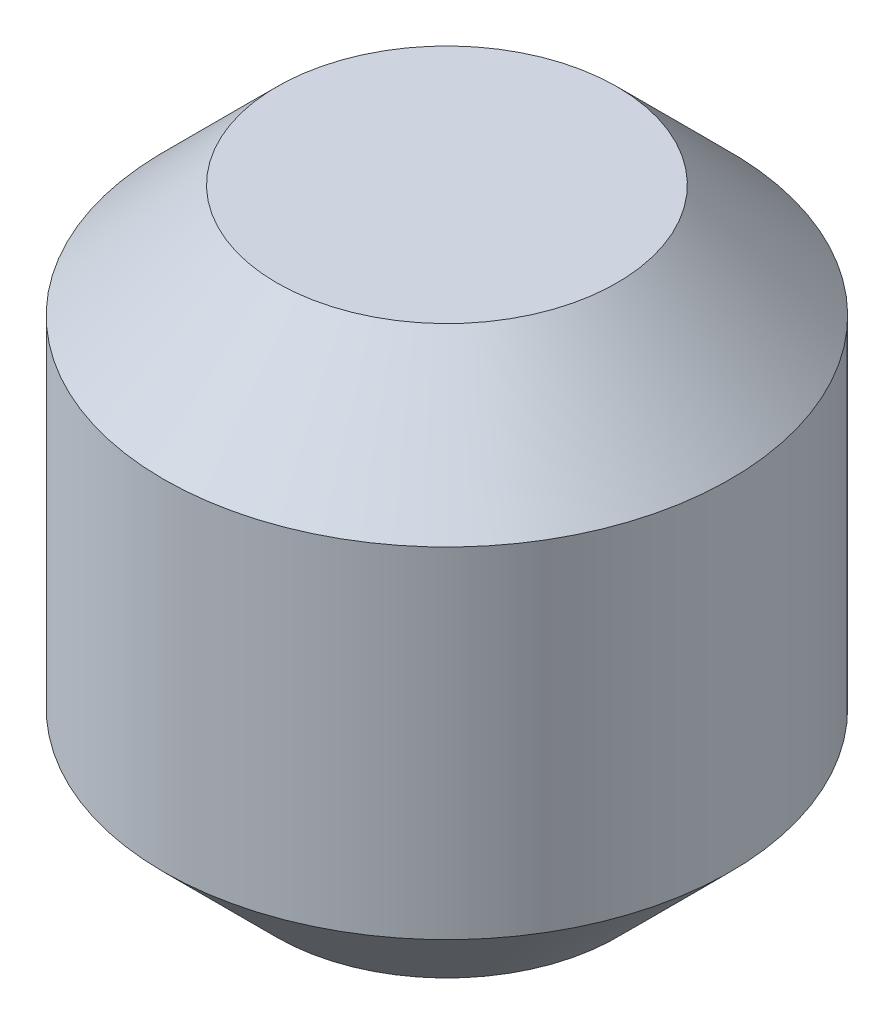
ISO-10303-21;
HEADER;
FILE_DESCRIPTION(('STEP AP214'),'2;1');
FILE_NAME('part.step','',(''),(''),'','','');
FILE_SCHEMA(('AUTOMOTIVE_DESIGN { 1 0 10303 214 1 1 1 1 }'));
ENDSEC;
DATA;
#1=APPLICATION_CONTEXT('core data for automotive mechanical design processes');
#2=APPLICATION_PROTOCOL_DEFINITION('international standard','automotive_design',2000,#1);
#3=PRODUCT_CONTEXT('',#1,'mechanical');
#4=PRODUCT('Part','Part','',(#3));
#5=PRODUCT_RELATED_PRODUCT_CATEGORY('part','',(#4));
#6=PRODUCT_DEFINITION_FORMATION('','',#4);
#7=PRODUCT_DEFINITION_CONTEXT('part definition',#1,'design');
#8=PRODUCT_DEFINITION('design','',#6,#7);
#9=PRODUCT_DEFINITION_SHAPE('','',#8);
#10=(LENGTH_UNIT() NAMED_UNIT(*) SI_UNIT(.MILLI.,.METRE.));
#11=(NAMED_UNIT(*) PLANE_ANGLE_UNIT() SI_UNIT($,.RADIAN.));
#12=(NAMED_UNIT(*) SI_UNIT($,.STERADIAN.) SOLID_ANGLE_UNIT());
#13=UNCERTAINTY_MEASURE_WITH_UNIT(LENGTH_MEASURE(1.E-05),#10,'distance_accuracy_value','');
#14=(GEOMETRIC_REPRESENTATION_CONTEXT(3) GLOBAL_UNCERTAINTY_ASSIGNED_CONTEXT((#13)) GLOBAL_UNIT_ASSIGNED_CONTEXT((#10,
#11,#12)) REPRESENTATION_CONTEXT('',''));
#15=CARTESIAN_POINT('',(0.,0.,0.));
#16=DIRECTION('',(0.,0.,1.));
#17=DIRECTION('',(1.,0.,0.));
#18=AXIS2_PLACEMENT_3D('',#15,#16,#17);
#19=CARTESIAN_POINT('',(18.9864560285855,50.,23.441436423866));
#20=DIRECTION('',(0.,-1.,0.));
#21=DIRECTION('',(0.,0.,-1.));
#22=AXIS2_PLACEMENT_3D('',#19,#20,#21);
#23=CYLINDRICAL_SURFACE('',#22,25.);
#24=CARTESIAN_POINT('',(18.9864560285855,10.,23.441436423866));
#25=DIRECTION('',(0.,1.,0.));
#26=DIRECTION('',(0.,0.,1.));
#27=AXIS2_PLACEMENT_3D('',#24,#25,#26);
#28=CIRCLE('',#27,25.);
#29=CARTESIAN_POINT('',(18.9864560285855,10.,48.441436423866));
#30=VERTEX_POINT('',#29);
#31=EDGE_CURVE('E49',#30,#30,#28,.T.);
#32=ORIENTED_EDGE('',*,*,#31,.T.);
#33=EDGE_LOOP('',(#32));
#34=FACE_BOUND('',#33,.T.);
#35=CARTESIAN_POINT('',(18.9864560285855,40.,23.441436423866));
#36=DIRECTION('',(0.,1.,0.));
#37=DIRECTION('',(0.,0.,1.));
#38=AXIS2_PLACEMENT_3D('',#35,#36,#37);
#39=CIRCLE('',#38,25.);
#40=CARTESIAN_POINT('',(18.9864560285855,40.,48.441436423866));
#41=VERTEX_POINT('',#40);
#42=EDGE_CURVE('E54',#41,#41,#39,.F.);
#43=ORIENTED_EDGE('',*,*,#42,.T.);
#44=EDGE_LOOP('',(#43));
#45=FACE_BOUND('',#44,.T.);
#46=ADVANCED_FACE('F40',(#34,#45),#23,.T.);
#47=CARTESIAN_POINT('',(18.9864560285855,50.,23.441436423866));
#48=DIRECTION('',(0.,1.,0.));
#49=DIRECTION('',(0.,0.,1.));
#50=AXIS2_PLACEMENT_3D('',#47,#48,#49);
#51=PLANE('',#50);
#52=CARTESIAN_POINT('',(18.9864560285855,50.,23.441436423866));
#53=DIRECTION('',(0.,1.,0.));
#54=DIRECTION('',(0.,0.,1.));
#55=AXIS2_PLACEMENT_3D('',#52,#53,#54);
#56=CIRCLE('',#55,15.);
#57=CARTESIAN_POINT('',(18.9864560285855,50.,38.441436423866));
#58=VERTEX_POINT('',#57);
#59=EDGE_CURVE('E59',#58,#58,#56,.T.);
#60=ORIENTED_EDGE('',*,*,#59,.T.);
#61=EDGE_LOOP('',(#60));
#62=FACE_BOUND('',#61,.T.);
#63=ADVANCED_FACE('F66',(#62),#51,.T.);
#64=CARTESIAN_POINT('',(18.9864560285855,0.,23.441436423866));
#65=DIRECTION('',(0.,1.,0.));
#66=DIRECTION('',(0.,0.,1.));
#67=AXIS2_PLACEMENT_3D('',#64,#65,#66);
#68=PLANE('',#67);
#69=CARTESIAN_POINT('',(18.9864560285855,0.,23.441436423866));
#70=DIRECTION('',(0.,1.,0.));
#71=DIRECTION('',(0.,0.,1.));
#72=AXIS2_PLACEMENT_3D('',#69,#70,#71);
#73=CIRCLE('',#72,15.);
#74=CARTESIAN_POINT('',(18.9864560285855,0.,38.441436423866));
#75=VERTEX_POINT('',#74);
#76=EDGE_CURVE('E10',#75,#75,#73,.F.);
#77=ORIENTED_EDGE('',*,*,#76,.T.);
#78=EDGE_LOOP('',(#77));
#79=FACE_BOUND('',#78,.T.);
#80=ADVANCED_FACE('F70',(#79),#68,.F.);
#81=CARTESIAN_POINT('',(18.9864560285855,50.,23.441436423866));
#82=DIRECTION('',(0.,-1.,0.));
#83=DIRECTION('',(0.,0.,-1.));
#84=AXIS2_PLACEMENT_3D('',#81,#82,#83);
#85=CONICAL_SURFACE('',#84,15.,0.785398163397447);
#86=ORIENTED_EDGE('',*,*,#42,.F.);
#87=EDGE_LOOP('',(#86));
#88=FACE_BOUND('',#87,.T.);
#89=ORIENTED_EDGE('',*,*,#59,.F.);
#90=EDGE_LOOP('',(#89));
#91=FACE_BOUND('',#90,.T.);
#92=ADVANCED_FACE('F68',(#88,#91),#85,.T.);
#93=CARTESIAN_POINT('',(18.9864560285855,10.,23.441436423866));
#94=DIRECTION('',(0.,1.,0.));
#95=DIRECTION('',(0.,0.,1.));
#96=AXIS2_PLACEMENT_3D('',#93,#94,#95);
#97=CONICAL_SURFACE('',#96,25.,0.78539816339745);
#98=ORIENTED_EDGE('',*,*,#76,.F.);
#99=EDGE_LOOP('',(#98));
#100=FACE_BOUND('',#99,.T.);
#101=ORIENTED_EDGE('',*,*,#31,.F.);
#102=EDGE_LOOP('',(#101));
#103=FACE_BOUND('',#102,.T.);
#104=ADVANCED_FACE('F43',(#100,#103),#97,.T.);
#105=CLOSED_SHELL('',(#46,#63,#80,#92,#104));
#106=MANIFOLD_SOLID_BREP('B2',#105);
#107=ADVANCED_BREP_SHAPE_REPRESENTATION('',(#18,#106),#14);
#108=SHAPE_DEFINITION_REPRESENTATION(#9,#107);
ENDSEC;
END-ISO-10303-21;
